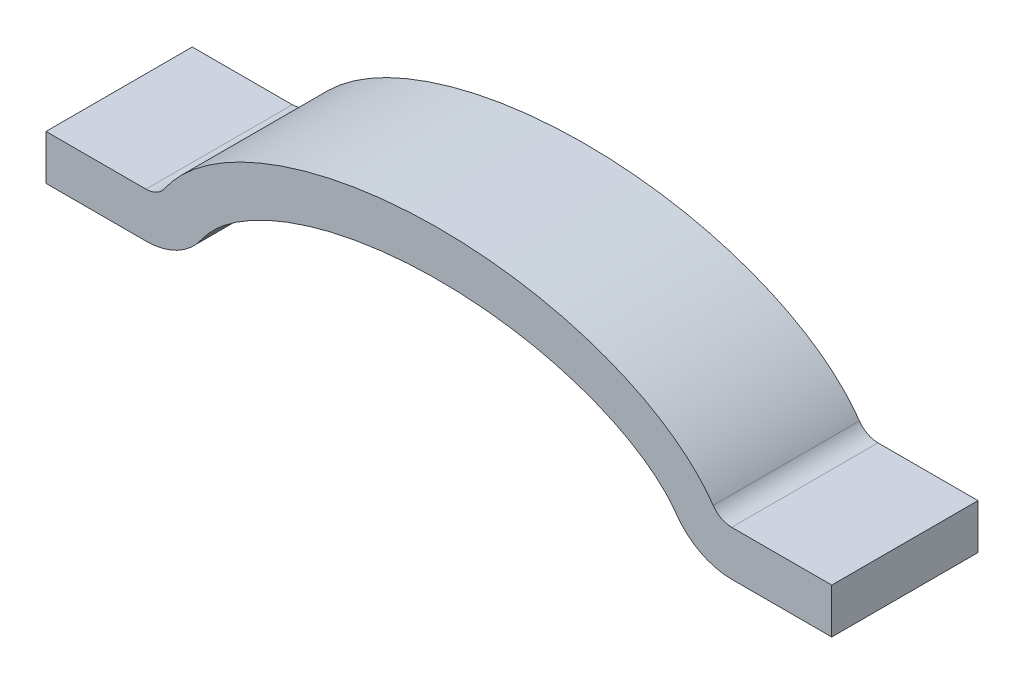
ISO-10303-21;
HEADER;
FILE_DESCRIPTION(('STEP AP214'),'2;1');
FILE_NAME('part.step','',(''),(''),'','','');
FILE_SCHEMA(('AUTOMOTIVE_DESIGN { 1 0 10303 214 1 1 1 1 }'));
ENDSEC;
DATA;
#1=APPLICATION_CONTEXT('core data for automotive mechanical design processes');
#2=APPLICATION_PROTOCOL_DEFINITION('international standard','automotive_design',2000,#1);
#3=PRODUCT_CONTEXT('',#1,'mechanical');
#4=PRODUCT('Part','Part','',(#3));
#5=PRODUCT_RELATED_PRODUCT_CATEGORY('part','',(#4));
#6=PRODUCT_DEFINITION_FORMATION('','',#4);
#7=PRODUCT_DEFINITION_CONTEXT('part definition',#1,'design');
#8=PRODUCT_DEFINITION('design','',#6,#7);
#9=PRODUCT_DEFINITION_SHAPE('','',#8);
#10=(LENGTH_UNIT() NAMED_UNIT(*) SI_UNIT(.MILLI.,.METRE.));
#11=(NAMED_UNIT(*) PLANE_ANGLE_UNIT() SI_UNIT($,.RADIAN.));
#12=(NAMED_UNIT(*) SI_UNIT($,.STERADIAN.) SOLID_ANGLE_UNIT());
#13=UNCERTAINTY_MEASURE_WITH_UNIT(LENGTH_MEASURE(1.E-05),#10,'distance_accuracy_value','');
#14=(GEOMETRIC_REPRESENTATION_CONTEXT(3) GLOBAL_UNCERTAINTY_ASSIGNED_CONTEXT((#13)) GLOBAL_UNIT_ASSIGNED_CONTEXT((#10,
#11,#12)) REPRESENTATION_CONTEXT('',''));
#15=CARTESIAN_POINT('',(0.,0.,0.));
#16=DIRECTION('',(0.,0.,1.));
#17=DIRECTION('',(1.,0.,0.));
#18=AXIS2_PLACEMENT_3D('',#15,#16,#17);
#19=CARTESIAN_POINT('',(34.9161860349977,0.,13.));
#20=DIRECTION('',(1.,0.,0.));
#21=DIRECTION('',(0.,0.,-1.));
#22=AXIS2_PLACEMENT_3D('',#19,#20,#21);
#23=PLANE('',#22);
#24=DIRECTION('',(0.,-1.,0.));
#25=VECTOR('',#24,1.);
#26=CARTESIAN_POINT('',(34.9161860349977,0.,0.));
#27=LINE('',#26,#25);
#28=CARTESIAN_POINT('',(34.9161860349977,4.,0.));
#29=VERTEX_POINT('',#28);
#30=CARTESIAN_POINT('',(34.9161860349977,0.,0.));
#31=VERTEX_POINT('',#30);
#32=EDGE_CURVE('E11',#29,#31,#27,.T.);
#33=ORIENTED_EDGE('',*,*,#32,.F.);
#34=DIRECTION('',(0.,0.,1.));
#35=VECTOR('',#34,1.);
#36=CARTESIAN_POINT('',(34.9161860349977,4.,13.));
#37=LINE('',#36,#35);
#38=CARTESIAN_POINT('',(34.9161860349977,4.,13.));
#39=VERTEX_POINT('',#38);
#40=EDGE_CURVE('E107',#39,#29,#37,.F.);
#41=ORIENTED_EDGE('',*,*,#40,.F.);
#42=DIRECTION('',(0.,-1.,0.));
#43=VECTOR('',#42,1.);
#44=CARTESIAN_POINT('',(34.9161860349977,0.,13.));
#45=LINE('',#44,#43);
#46=CARTESIAN_POINT('',(34.9161860349977,0.,13.));
#47=VERTEX_POINT('',#46);
#48=EDGE_CURVE('E45',#39,#47,#45,.T.);
#49=ORIENTED_EDGE('',*,*,#48,.T.);
#50=DIRECTION('',(0.,0.,-1.));
#51=VECTOR('',#50,1.);
#52=CARTESIAN_POINT('',(34.9161860349977,0.,13.));
#53=LINE('',#52,#51);
#54=EDGE_CURVE('E139',#47,#31,#53,.T.);
#55=ORIENTED_EDGE('',*,*,#54,.T.);
#56=EDGE_LOOP('',(#33,#41,#49,#55));
#57=FACE_BOUND('',#56,.T.);
#58=ADVANCED_FACE('F36',(#57),#23,.T.);
#59=CARTESIAN_POINT('',(-22.,0.,13.));
#60=DIRECTION('',(0.,0.,1.));
#61=DIRECTION('',(1.,0.,0.));
#62=AXIS2_PLACEMENT_3D('',#59,#60,#61);
#63=PLANE('',#62);
#64=DIRECTION('',(1.,0.,0.));
#65=VECTOR('',#64,1.);
#66=CARTESIAN_POINT('',(-22.,0.,13.));
#67=LINE('',#66,#65);
#68=CARTESIAN_POINT('',(-34.9161860349977,0.,13.));
#69=VERTEX_POINT('',#68);
#70=CARTESIAN_POINT('',(-26.0263948261629,0.,13.));
#71=VERTEX_POINT('',#70);
#72=EDGE_CURVE('E162',#69,#71,#67,.T.);
#73=ORIENTED_EDGE('',*,*,#72,.T.);
#74=CARTESIAN_POINT('',(-26.0263948261629,5.99999999999997,13.));
#75=DIRECTION('',(0.,0.,-1.));
#76=DIRECTION('',(-1.,0.,0.));
#77=AXIS2_PLACEMENT_3D('',#74,#75,#76);
#78=CIRCLE('',#77,6.);
#79=CARTESIAN_POINT('',(-21.083393892477,2.59900870780584,13.));
#80=VERTEX_POINT('',#79);
#81=EDGE_CURVE('E53',#71,#80,#78,.F.);
#82=ORIENTED_EDGE('',*,*,#81,.T.);
#83=CARTESIAN_POINT('',(-22.,0.,13.));
#84=CARTESIAN_POINT('',(-22.,0.432036641839711,13.));
#85=CARTESIAN_POINT('',(-21.8548863619666,1.29610992551914,13.));
#86=CARTESIAN_POINT('',(-20.9973878430744,2.88664464705841,13.));
#87=CARTESIAN_POINT('',(-19.2580049467167,4.66938679657808,13.));
#88=CARTESIAN_POINT('',(-15.7412521676776,6.99878575691308,13.));
#89=CARTESIAN_POINT('',(-9.3643610379705,9.3281522587363,13.));
#90=CARTESIAN_POINT('',(0.,10.3359238706319,13.));
#91=CARTESIAN_POINT('',(9.36436103797051,9.3281522587363,13.));
#92=CARTESIAN_POINT('',(15.7412521676776,6.99878575691308,13.));
#93=CARTESIAN_POINT('',(19.2580049467167,4.66938679657808,13.));
#94=CARTESIAN_POINT('',(20.9973878430744,2.8866446470584,13.));
#95=CARTESIAN_POINT('',(21.8548863619666,1.29610992551914,13.));
#96=CARTESIAN_POINT('',(22.,0.432036641839715,13.));
#97=CARTESIAN_POINT('',(22.,0.,13.));
#98=B_SPLINE_CURVE_WITH_KNOTS('',3,(#83,#84,#85,#86,#87,#88,#89,#90,#91,#92,#93,#94,#95,#96,
#97),.UNSPECIFIED.,.F.,.F.,(4,1,1,1,1,1,1,1,1,1,1,1,4),(3.14159265358979,3.33794219443916,
3.53429173528852,3.73064127613788,3.92699081698724,4.31968989868597,4.71238898038469,
5.10508806208341,5.49778714378214,5.6941366846315,5.89048622548086,6.08683576633022,
6.28318530717959),.UNSPECIFIED.);
#99=CARTESIAN_POINT('',(21.083393892477,2.59900870780584,13.));
#100=VERTEX_POINT('',#99);
#101=EDGE_CURVE('E163',#80,#100,#98,.T.);
#102=ORIENTED_EDGE('',*,*,#101,.T.);
#103=CARTESIAN_POINT('',(26.0263948261629,5.99999999999997,13.));
#104=DIRECTION('',(0.,0.,-1.));
#105=DIRECTION('',(-1.,0.,0.));
#106=AXIS2_PLACEMENT_3D('',#103,#104,#105);
#107=CIRCLE('',#106,6.);
#108=CARTESIAN_POINT('',(26.0263948261629,0.,13.));
#109=VERTEX_POINT('',#108);
#110=EDGE_CURVE('E160',#100,#109,#107,.F.);
#111=ORIENTED_EDGE('',*,*,#110,.T.);
#112=DIRECTION('',(1.,0.,0.));
#113=VECTOR('',#112,1.);
#114=CARTESIAN_POINT('',(22.,0.,13.));
#115=LINE('',#114,#113);
#116=EDGE_CURVE('E151',#109,#47,#115,.T.);
#117=ORIENTED_EDGE('',*,*,#116,.T.);
#118=ORIENTED_EDGE('',*,*,#48,.F.);
#119=DIRECTION('',(-1.,0.,0.));
#120=VECTOR('',#119,1.);
#121=CARTESIAN_POINT('',(22.,4.,13.));
#122=LINE('',#121,#120);
#123=CARTESIAN_POINT('',(26.0263948261629,4.,13.));
#124=VERTEX_POINT('',#123);
#125=EDGE_CURVE('E231',#124,#39,#122,.F.);
#126=ORIENTED_EDGE('',*,*,#125,.F.);
#127=CARTESIAN_POINT('',(26.0263948261629,5.99999999999997,13.));
#128=DIRECTION('',(0.,0.,-1.));
#129=DIRECTION('',(-1.,0.,0.));
#130=AXIS2_PLACEMENT_3D('',#127,#128,#129);
#131=CIRCLE('',#130,2.);
#132=CARTESIAN_POINT('',(24.3787278482676,4.86633623593526,13.));
#133=VERTEX_POINT('',#132);
#134=EDGE_CURVE('E102',#133,#124,#131,.F.);
#135=ORIENTED_EDGE('',*,*,#134,.F.);
#136=CARTESIAN_POINT('',(-26.,-5.25591541948676E-09,13.));
#137=CARTESIAN_POINT('',(-26.0000116676451,0.111537247286349,13.));
#138=CARTESIAN_POINT('',(-25.9976258289216,0.223078285323674,13.));
#139=CARTESIAN_POINT('',(-25.9878872850968,0.448666430823199,13.));
#140=CARTESIAN_POINT('',(-25.9804149655458,0.56270837405115,13.));
#141=CARTESIAN_POINT('',(-25.9601396738284,0.792413314224165,13.));
#142=CARTESIAN_POINT('',(-25.9472420470309,0.908067983077297,13.));
#143=CARTESIAN_POINT('',(-25.915945897434,1.14006903279323,13.));
#144=CARTESIAN_POINT('',(-25.8974821013963,1.25640660479358,13.));
#145=CARTESIAN_POINT('',(-25.8550595671101,1.48888395466193,13.));
#146=CARTESIAN_POINT('',(-25.8310646704827,1.6050171275041,13.));
#147=CARTESIAN_POINT('',(-25.7777484707093,1.83630999130887,13.));
#148=CARTESIAN_POINT('',(-25.7484160494636,1.95146711504999,13.));
#149=CARTESIAN_POINT('',(-25.6847150602839,2.18020284317876,13.));
#150=CARTESIAN_POINT('',(-25.6503536260085,2.29378343805561,13.));
#151=CARTESIAN_POINT('',(-25.576956710448,2.51896209143195,13.));
#152=CARTESIAN_POINT('',(-25.5379387429657,2.63056587201652,13.));
#153=CARTESIAN_POINT('',(-25.4552024021435,2.85270133325781,13.));
#154=CARTESIAN_POINT('',(-25.4114597755304,2.96322396550021,13.));
#155=CARTESIAN_POINT('',(-25.3189473938992,3.18415346660159,13.));
#156=CARTESIAN_POINT('',(-25.2701104006534,3.2945321547338,13.));
#157=CARTESIAN_POINT('',(-25.1674048004263,3.5150226557403,13.));
#158=CARTESIAN_POINT('',(-25.1134695287242,3.62510338377648,13.));
#159=CARTESIAN_POINT('',(-25.0005687603073,3.84486090717794,13.));
#160=CARTESIAN_POINT('',(-24.9415371214083,3.9545036889688,13.));
#161=CARTESIAN_POINT('',(-24.8184478876507,4.17326325245095,13.));
#162=CARTESIAN_POINT('',(-24.7543245859132,4.28234302730507,13.));
#163=CARTESIAN_POINT('',(-24.6210568142596,4.49987062809492,13.));
#164=CARTESIAN_POINT('',(-24.551846981188,4.60827837147226,13.));
#165=CARTESIAN_POINT('',(-24.4084091092638,4.82437233822117,13.));
#166=CARTESIAN_POINT('',(-24.3341159707699,4.93201530889777,13.));
#167=CARTESIAN_POINT('',(-24.1805098064464,5.1465060090048,13.));
#168=CARTESIAN_POINT('',(-24.1011318763264,5.25330721555847,13.));
#169=CARTESIAN_POINT('',(-23.9376358793378,5.465685050551,13.));
#170=CARTESIAN_POINT('',(-23.8534658733088,5.57122165086724,13.));
#171=CARTESIAN_POINT('',(-23.6806810325843,5.78080997511271,13.));
#172=CARTESIAN_POINT('',(-23.5920238340478,5.88482672709309,13.));
#173=CARTESIAN_POINT('',(-23.4102450544272,6.09150776484632,13.));
#174=CARTESIAN_POINT('',(-23.3170780484472,6.19413207563363,13.));
#175=CARTESIAN_POINT('',(-23.1262558984359,6.39810968013806,13.));
#176=CARTESIAN_POINT('',(-23.0285536250027,6.49941876570225,13.));
#177=CARTESIAN_POINT('',(-22.7261165515322,6.80408823826286,13.));
#178=CARTESIAN_POINT('',(-22.5167459416307,7.00287359830188,13.));
#179=CARTESIAN_POINT('',(-22.0798868853556,7.39575577415625,13.));
#180=CARTESIAN_POINT('',(-21.8520176546229,7.58942688279915,13.));
#181=CARTESIAN_POINT('',(-21.3789946630926,7.97090126508661,13.));
#182=CARTESIAN_POINT('',(-21.13351925821,8.15830480213568,13.));
#183=CARTESIAN_POINT('',(-20.6264401691121,8.52651690174705,13.));
#184=CARTESIAN_POINT('',(-20.3645738543199,8.7069625142317,13.));
#185=CARTESIAN_POINT('',(-19.8247588027536,9.06125072564397,13.));
#186=CARTESIAN_POINT('',(-19.546563156856,9.2347161911291,13.));
#187=CARTESIAN_POINT('',(-18.9741946965365,9.57474769189839,13.));
#188=CARTESIAN_POINT('',(-18.6797941952976,9.74092968282077,13.));
#189=CARTESIAN_POINT('',(-18.0763789806,10.0652540159631,13.));
#190=CARTESIAN_POINT('',(-17.7671841379604,10.2230603717114,13.));
#191=CARTESIAN_POINT('',(-17.1358146082921,10.5301159281395,13.));
#192=CARTESIAN_POINT('',(-16.8135048236157,10.6790864692833,13.));
#193=CARTESIAN_POINT('',(-16.1563567979412,10.9685343106685,13.));
#194=CARTESIAN_POINT('',(-15.8214002132375,11.1087422747537,13.));
#195=CARTESIAN_POINT('',(-15.1394655070584,11.380573016466,13.));
#196=CARTESIAN_POINT('',(-14.7923851076409,11.5119386431155,13.));
#197=CARTESIAN_POINT('',(-14.086757023152,11.7658746909795,13.));
#198=CARTESIAN_POINT('',(-13.7281218143803,11.88820144439,13.));
#199=CARTESIAN_POINT('',(-12.9999804917653,12.1237597026379,13.));
#200=CARTESIAN_POINT('',(-12.6304001582384,12.2367614083769,13.));
#201=CARTESIAN_POINT('',(-11.8810004293432,12.4532996975759,13.));
#202=CARTESIAN_POINT('',(-11.501118686008,12.5566202125045,13.));
#203=CARTESIAN_POINT('',(-10.7317776314485,12.7533690968808,13.));
#204=CARTESIAN_POINT('',(-10.3422665196632,12.846594671185,13.));
#205=CARTESIAN_POINT('',(-9.55512700269836,13.0225123751248,13.));
#206=CARTESIAN_POINT('',(-9.15746143610106,13.1050381251034,13.));
#207=CARTESIAN_POINT('',(-8.35560256669944,13.2593762182577,13.));
#208=CARTESIAN_POINT('',(-7.95138522936855,13.331062741599,13.));
#209=CARTESIAN_POINT('',(-6.72488526673784,13.5309431058362,13.));
#210=CARTESIAN_POINT('',(-5.89967836668501,13.6415405098872,13.));
#211=CARTESIAN_POINT('',(-4.23333341247432,13.8198639361473,13.));
#212=CARTESIAN_POINT('',(-3.39213171827096,13.8869837014631,13.));
#213=CARTESIAN_POINT('',(-1.70063272261015,13.9772291723469,13.));
#214=CARTESIAN_POINT('',(-0.850316361305075,14.,13.));
#215=CARTESIAN_POINT('',(0.850316361304433,14.,13.));
#216=CARTESIAN_POINT('',(1.70063272260886,13.977229172347,13.));
#217=CARTESIAN_POINT('',(3.39213171826967,13.8869837014632,13.));
#218=CARTESIAN_POINT('',(4.23333341247369,13.8198639361473,13.));
#219=CARTESIAN_POINT('',(5.89967836667695,13.6415405098881,13.));
#220=CARTESIAN_POINT('',(6.72488526672175,13.5309431058383,13.));
#221=CARTESIAN_POINT('',(7.95138522934303,13.3310627416034,13.));
#222=CARTESIAN_POINT('',(8.35560256667242,13.2593762182626,13.));
#223=CARTESIAN_POINT('',(9.15746143609327,13.1050381251052,13.));
#224=CARTESIAN_POINT('',(9.55512700271117,13.0225123751223,13.));
#225=CARTESIAN_POINT('',(10.342266519711,12.846594671174,13.));
#226=CARTESIAN_POINT('',(10.7317776315108,12.7533690968658,13.));
#227=CARTESIAN_POINT('',(11.5011186860734,12.556620212487,13.));
#228=CARTESIAN_POINT('',(11.8810004293976,12.4532996975607,13.));
#229=CARTESIAN_POINT('',(12.6304001582672,12.2367614083681,13.));
#230=CARTESIAN_POINT('',(12.9999804917797,12.1237597026333,13.));
#231=CARTESIAN_POINT('',(13.7281218143619,11.888201444396,13.));
#232=CARTESIAN_POINT('',(14.0867570231153,11.7658746909921,13.));
#233=CARTESIAN_POINT('',(14.7923851076046,11.5119386431292,13.));
#234=CARTESIAN_POINT('',(15.1394655070404,11.3805730164732,13.));
#235=CARTESIAN_POINT('',(15.8214002133122,11.1087422747239,13.));
#236=CARTESIAN_POINT('',(16.1563567980896,10.9685343106064,13.));
#237=CARTESIAN_POINT('',(16.8135048237357,10.6790864692273,13.));
#238=CARTESIAN_POINT('',(17.1358146083127,10.5301159281282,13.));
#239=CARTESIAN_POINT('',(17.7671841378536,10.2230603717646,13.));
#240=CARTESIAN_POINT('',(18.0763789804637,10.0652540160334,13.));
#241=CARTESIAN_POINT('',(18.6797941951791,9.74092968288742,13.));
#242=CARTESIAN_POINT('',(18.9741946964635,9.57474769194123,13.));
#243=CARTESIAN_POINT('',(19.5465631567266,9.23471619120654,13.));
#244=CARTESIAN_POINT('',(19.8247588025261,9.06125072578613,13.));
#245=CARTESIAN_POINT('',(20.3645738540333,8.70696251442677,13.));
#246=CARTESIAN_POINT('',(20.6264401688605,8.52651690192429,13.));
#247=CARTESIAN_POINT('',(21.1335192580166,8.1583048022814,13.));
#248=CARTESIAN_POINT('',(21.3789946629229,7.97090126521917,13.));
#249=CARTESIAN_POINT('',(21.8520176544375,7.58942688295277,13.));
#250=CARTESIAN_POINT('',(22.0798868851335,7.3957557743473,13.));
#251=CARTESIAN_POINT('',(22.5167459416699,7.00287359827503,13.));
#252=CARTESIAN_POINT('',(22.7261165518533,6.80408823796273,13.));
#253=CARTESIAN_POINT('',(23.0285536251686,6.49941876552382,13.));
#254=CARTESIAN_POINT('',(23.126255898194,6.3981096803828,13.));
#255=CARTESIAN_POINT('',(23.3170780480187,6.19413207610534,13.));
#256=CARTESIAN_POINT('',(23.4102450542003,6.09150776510358,13.));
#257=CARTESIAN_POINT('',(23.5920238341204,5.88482672701131,13.));
#258=CARTESIAN_POINT('',(23.6806810327581,5.78080997490921,13.));
#259=CARTESIAN_POINT('',(23.8534658733679,5.5712216507883,13.));
#260=CARTESIAN_POINT('',(23.9376358791933,5.4656850507284,13.));
#261=CARTESIAN_POINT('',(24.1011318761151,5.25330721584322,13.));
#262=CARTESIAN_POINT('',(24.1805098063578,5.14650600912951,13.));
#263=CARTESIAN_POINT('',(24.3341159706946,4.93201530900185,13.));
#264=CARTESIAN_POINT('',(24.40840910909,4.82437233847237,13.));
#265=CARTESIAN_POINT('',(24.5518469807964,4.60827837207256,13.));
#266=CARTESIAN_POINT('',(24.6210568137503,4.49987062889827,13.));
#267=CARTESIAN_POINT('',(24.7543245855127,4.28234302798651,13.));
#268=CARTESIAN_POINT('',(24.8184478874569,4.17326325279536,13.));
#269=CARTESIAN_POINT('',(24.9415371216399,3.95450368855732,13.));
#270=CARTESIAN_POINT('',(25.000568760755,3.84486090634631,13.));
#271=CARTESIAN_POINT('',(25.1134695291365,3.62510338293474,13.));
#272=CARTESIAN_POINT('',(25.1674048006193,3.51502265532528,13.));
#273=CARTESIAN_POINT('',(25.2701104007492,3.29453215452878,13.));
#274=CARTESIAN_POINT('',(25.3189473940913,3.18415346616786,13.));
#275=CARTESIAN_POINT('',(25.4114597756033,2.96322396530142,13.));
#276=CARTESIAN_POINT('',(25.4552024020288,2.85270133353429,13.));
#277=CARTESIAN_POINT('',(25.5379387427875,2.63056587252623,13.));
#278=CARTESIAN_POINT('',(25.5769567103644,2.51896209168857,13.));
#279=CARTESIAN_POINT('',(25.6503536260101,2.29378343805051,13.));
#280=CARTESIAN_POINT('',(25.684715060287,2.18020284316853,13.));
#281=CARTESIAN_POINT('',(25.7484160493808,1.95146711534656,13.));
#282=CARTESIAN_POINT('',(25.7777484705532,1.83630999192129,13.));
#283=CARTESIAN_POINT('',(25.83106467028,1.60501712844776,13.));
#284=CARTESIAN_POINT('',(25.8550595669203,1.48888395561773,13.));
#285=CARTESIAN_POINT('',(25.8974821012935,1.25640660544136,13.));
#286=CARTESIAN_POINT('',(25.9159458973902,1.14006903311805,13.));
#287=CARTESIAN_POINT('',(25.9472420469846,0.908067983421301,13.));
#288=CARTESIAN_POINT('',(25.9601396737515,0.792413314914489,13.));
#289=CARTESIAN_POINT('',(25.9804149655618,0.562708374048563,13.));
#290=CARTESIAN_POINT('',(25.9878872851732,0.448666429775861,13.));
#291=CARTESIAN_POINT('',(25.9976258289061,0.223078284976777,13.));
#292=CARTESIAN_POINT('',(26.0000116675999,0.111537248689892,13.));
#293=CARTESIAN_POINT('',(26.,-2.10236242051774E-09,13.));
#294=B_SPLINE_CURVE_WITH_KNOTS('',3,(#136,#137,#138,#139,#140,#141,#142,#143,#144,#145,#146,
#147,#148,#149,#150,#151,#152,#153,#154,#155,#156,#157,#158,#159,#160,#161,#162,#163,#164,#165,
#166,#167,#168,#169,#170,#171,#172,#173,#174,#175,#176,#177,#178,#179,#180,#181,#182,#183,#184,
#185,#186,#187,#188,#189,#190,#191,#192,#193,#194,#195,#196,#197,#198,#199,#200,#201,#202,#203,
#204,#205,#206,#207,#208,#209,#210,#211,#212,#213,#214,#215,#216,#217,#218,#219,#220,#221,#222,
#223,#224,#225,#226,#227,#228,#229,#230,#231,#232,#233,#234,#235,#236,#237,#238,#239,#240,#241,
#242,#243,#244,#245,#246,#247,#248,#249,#250,#251,#252,#253,#254,#255,#256,#257,#258,#259,#260,
#261,#262,#263,#264,#265,#266,#267,#268,#269,#270,#271,#272,#273,#274,#275,#276,#277,#278,#279,
#280,#281,#282,#283,#284,#285,#286,#287,#288,#289,#290,#291,#292,#293),.UNSPECIFIED.,.F.,.F.,(4,
2,2,2,2,2,2,2,2,2,2,2,2,2,2,2,2,2,2,2,2,2,2,2,2,2,2,2,2,2,2,2,2,2,2,2,2,2,2,2,2,2,2,2,2,2,2,2,2,
2,2,2,2,2,2,2,2,2,2,2,2,2,2,2,2,2,2,2,2,2,2,2,2,2,2,2,2,2,4),(0.,0.334591789746542,
0.677336812858055,1.02632737627372,1.37958114205443,1.73521322792134,2.09159475891316,
2.44747557596909,2.80205773509361,3.1585553708871,3.52056192024408,3.88822160551874,
4.26170458649938,4.64121147442852,5.02697649710909,5.41926944722264,5.8183965570049,
6.22329407200158,6.63324503470354,7.04899786213921,7.47118101830255,8.33679232254686,
9.2335334475586,10.1596351408929,11.1133345604709,12.0965467306585,13.1104308997004,
14.1515568356346,15.2165209576283,16.3056441657962,17.4187588005548,18.5553293801477,
19.7145470935532,20.8954045060722,22.0967554563243,23.3149837249181,24.5464165421089,
27.0427967760967,29.5732773915513,32.1239249127651,34.6745724339769,37.2050530494334,
39.7014332833969,40.932866100583,42.15109436924,43.352445319537,44.5333027320222,
45.6925204453825,46.8290910249172,47.9422056597339,49.031328868143,50.0962929898102,
51.1374189256425,52.1513030948383,53.1345152646738,54.0882146843685,55.014316377783,
55.9110575026386,56.7766688080581,57.1988519624594,57.6146047907775,58.024555753954,
58.4294532679691,58.8285803783557,59.2208733279385,59.6066383499161,59.9861452390305,
60.3596282214272,60.7272879052643,61.0892944553647,61.4457920896268,61.8003742495608,
62.1562550666327,62.512636596653,62.8682686824921,63.2215224492561,63.5705130116307,
63.9132580378779,64.247849822377),.UNSPECIFIED.);
#295=CARTESIAN_POINT('',(-24.3787278482676,4.86633623593526,13.));
#296=VERTEX_POINT('',#295);
#297=EDGE_CURVE('E226',#296,#133,#294,.T.);
#298=ORIENTED_EDGE('',*,*,#297,.F.);
#299=CARTESIAN_POINT('',(-26.0263948261629,5.99999999999997,13.));
#300=DIRECTION('',(0.,0.,-1.));
#301=DIRECTION('',(-1.,0.,0.));
#302=AXIS2_PLACEMENT_3D('',#299,#300,#301);
#303=CIRCLE('',#302,2.);
#304=CARTESIAN_POINT('',(-26.0263948261629,3.99999999999997,13.));
#305=VERTEX_POINT('',#304);
#306=EDGE_CURVE('E232',#305,#296,#303,.F.);
#307=ORIENTED_EDGE('',*,*,#306,.F.);
#308=DIRECTION('',(-1.,0.,0.));
#309=VECTOR('',#308,1.);
#310=CARTESIAN_POINT('',(-22.,4.,13.));
#311=LINE('',#310,#309);
#312=CARTESIAN_POINT('',(-34.9161860349977,4.,13.));
#313=VERTEX_POINT('',#312);
#314=EDGE_CURVE('E240',#313,#305,#311,.F.);
#315=ORIENTED_EDGE('',*,*,#314,.F.);
#316=DIRECTION('',(0.,-1.,0.));
#317=VECTOR('',#316,1.);
#318=CARTESIAN_POINT('',(-34.9161860349977,0.,13.));
#319=LINE('',#318,#317);
#320=EDGE_CURVE('E131',#313,#69,#319,.T.);
#321=ORIENTED_EDGE('',*,*,#320,.T.);
#322=EDGE_LOOP('',(#73,#82,#102,#111,#117,#118,#126,#135,#298,#307,#315,#321));
#323=FACE_BOUND('',#322,.T.);
#324=ADVANCED_FACE('F158',(#323),#63,.T.);
#325=CARTESIAN_POINT('',(-34.9161860349977,0.,13.));
#326=DIRECTION('',(1.,0.,0.));
#327=DIRECTION('',(0.,0.,-1.));
#328=AXIS2_PLACEMENT_3D('',#325,#326,#327);
#329=PLANE('',#328);
#330=ORIENTED_EDGE('',*,*,#320,.F.);
#331=DIRECTION('',(0.,0.,1.));
#332=VECTOR('',#331,1.);
#333=CARTESIAN_POINT('',(-34.9161860349977,4.,13.));
#334=LINE('',#333,#332);
#335=CARTESIAN_POINT('',(-34.9161860349977,4.,0.));
#336=VERTEX_POINT('',#335);
#337=EDGE_CURVE('E241',#313,#336,#334,.F.);
#338=ORIENTED_EDGE('',*,*,#337,.T.);
#339=DIRECTION('',(0.,-1.,0.));
#340=VECTOR('',#339,1.);
#341=CARTESIAN_POINT('',(-34.9161860349977,0.,0.));
#342=LINE('',#341,#340);
#343=CARTESIAN_POINT('',(-34.9161860349977,0.,0.));
#344=VERTEX_POINT('',#343);
#345=EDGE_CURVE('E128',#336,#344,#342,.T.);
#346=ORIENTED_EDGE('',*,*,#345,.T.);
#347=DIRECTION('',(0.,0.,-1.));
#348=VECTOR('',#347,1.);
#349=CARTESIAN_POINT('',(-34.9161860349977,0.,13.));
#350=LINE('',#349,#348);
#351=EDGE_CURVE('E156',#69,#344,#350,.T.);
#352=ORIENTED_EDGE('',*,*,#351,.F.);
#353=EDGE_LOOP('',(#330,#338,#346,#352));
#354=FACE_BOUND('',#353,.T.);
#355=ADVANCED_FACE('F266',(#354),#329,.F.);
#356=CARTESIAN_POINT('',(26.0263948261629,5.99999999999997,0.));
#357=DIRECTION('',(0.,0.,1.));
#358=DIRECTION('',(1.,0.,0.));
#359=AXIS2_PLACEMENT_3D('',#356,#357,#358);
#360=PLANE('',#359);
#361=CARTESIAN_POINT('',(26.0263948261629,5.99999999999997,0.));
#362=DIRECTION('',(0.,0.,-1.));
#363=DIRECTION('',(-1.,0.,0.));
#364=AXIS2_PLACEMENT_3D('',#361,#362,#363);
#365=CIRCLE('',#364,2.);
#366=CARTESIAN_POINT('',(26.0263948261629,3.99999999999997,0.));
#367=VERTEX_POINT('',#366);
#368=CARTESIAN_POINT('',(24.3787278482676,4.86633623593526,0.));
#369=VERTEX_POINT('',#368);
#370=EDGE_CURVE('E99',#367,#369,#365,.T.);
#371=ORIENTED_EDGE('',*,*,#370,.F.);
#372=DIRECTION('',(-1.,0.,0.));
#373=VECTOR('',#372,1.);
#374=CARTESIAN_POINT('',(22.,4.,0.));
#375=LINE('',#374,#373);
#376=EDGE_CURVE('E111',#367,#29,#375,.F.);
#377=ORIENTED_EDGE('',*,*,#376,.T.);
#378=ORIENTED_EDGE('',*,*,#32,.T.);
#379=DIRECTION('',(1.,0.,0.));
#380=VECTOR('',#379,1.);
#381=CARTESIAN_POINT('',(22.,0.,0.));
#382=LINE('',#381,#380);
#383=CARTESIAN_POINT('',(26.0263948261629,0.,0.));
#384=VERTEX_POINT('',#383);
#385=EDGE_CURVE('E154',#384,#31,#382,.T.);
#386=ORIENTED_EDGE('',*,*,#385,.F.);
#387=CARTESIAN_POINT('',(26.0263948261629,5.99999999999997,0.));
#388=DIRECTION('',(0.,0.,-1.));
#389=DIRECTION('',(-1.,0.,0.));
#390=AXIS2_PLACEMENT_3D('',#387,#388,#389);
#391=CIRCLE('',#390,6.);
#392=CARTESIAN_POINT('',(21.083393892477,2.59900870780584,0.));
#393=VERTEX_POINT('',#392);
#394=EDGE_CURVE('E187',#384,#393,#391,.T.);
#395=ORIENTED_EDGE('',*,*,#394,.T.);
#396=CARTESIAN_POINT('',(-22.,0.,0.));
#397=CARTESIAN_POINT('',(-22.,0.432036641839711,0.));
#398=CARTESIAN_POINT('',(-21.8548863619666,1.29610992551914,0.));
#399=CARTESIAN_POINT('',(-20.9973878430744,2.88664464705841,0.));
#400=CARTESIAN_POINT('',(-19.2580049467167,4.66938679657808,0.));
#401=CARTESIAN_POINT('',(-15.7412521676776,6.99878575691308,0.));
#402=CARTESIAN_POINT('',(-9.3643610379705,9.3281522587363,0.));
#403=CARTESIAN_POINT('',(0.,10.3359238706319,0.));
#404=CARTESIAN_POINT('',(9.36436103797051,9.3281522587363,0.));
#405=CARTESIAN_POINT('',(15.7412521676776,6.99878575691308,0.));
#406=CARTESIAN_POINT('',(19.2580049467167,4.66938679657808,0.));
#407=CARTESIAN_POINT('',(20.9973878430744,2.8866446470584,0.));
#408=CARTESIAN_POINT('',(21.8548863619666,1.29610992551914,0.));
#409=CARTESIAN_POINT('',(22.,0.432036641839715,0.));
#410=CARTESIAN_POINT('',(22.,0.,0.));
#411=B_SPLINE_CURVE_WITH_KNOTS('',3,(#396,#397,#398,#399,#400,#401,#402,#403,#404,#405,#406,
#407,#408,#409,#410),.UNSPECIFIED.,.F.,.F.,(4,1,1,1,1,1,1,1,1,1,1,1,4),(3.14159265358979,
3.33794219443916,3.53429173528852,3.73064127613788,3.92699081698724,4.31968989868597,
4.71238898038469,5.10508806208341,5.49778714378214,5.6941366846315,5.89048622548086,
6.08683576633022,6.28318530717959),.UNSPECIFIED.);
#412=CARTESIAN_POINT('',(-21.083393892477,2.59900870780584,0.));
#413=VERTEX_POINT('',#412);
#414=EDGE_CURVE('E169',#413,#393,#411,.T.);
#415=ORIENTED_EDGE('',*,*,#414,.F.);
#416=CARTESIAN_POINT('',(-26.0263948261629,5.99999999999997,0.));
#417=DIRECTION('',(0.,0.,-1.));
#418=DIRECTION('',(-1.,0.,0.));
#419=AXIS2_PLACEMENT_3D('',#416,#417,#418);
#420=CIRCLE('',#419,6.);
#421=CARTESIAN_POINT('',(-26.0263948261629,0.,0.));
#422=VERTEX_POINT('',#421);
#423=EDGE_CURVE('E184',#413,#422,#420,.T.);
#424=ORIENTED_EDGE('',*,*,#423,.T.);
#425=DIRECTION('',(1.,0.,0.));
#426=VECTOR('',#425,1.);
#427=CARTESIAN_POINT('',(-22.,0.,0.));
#428=LINE('',#427,#426);
#429=EDGE_CURVE('E166',#344,#422,#428,.T.);
#430=ORIENTED_EDGE('',*,*,#429,.F.);
#431=ORIENTED_EDGE('',*,*,#345,.F.);
#432=DIRECTION('',(-1.,0.,0.));
#433=VECTOR('',#432,1.);
#434=CARTESIAN_POINT('',(-22.,4.,0.));
#435=LINE('',#434,#433);
#436=CARTESIAN_POINT('',(-26.0263948261629,4.,0.));
#437=VERTEX_POINT('',#436);
#438=EDGE_CURVE('E115',#336,#437,#435,.F.);
#439=ORIENTED_EDGE('',*,*,#438,.T.);
#440=CARTESIAN_POINT('',(-26.0263948261629,5.99999999999997,0.));
#441=DIRECTION('',(0.,0.,-1.));
#442=DIRECTION('',(-1.,0.,0.));
#443=AXIS2_PLACEMENT_3D('',#440,#441,#442);
#444=CIRCLE('',#443,2.);
#445=CARTESIAN_POINT('',(-24.3787278482676,4.86633623593526,0.));
#446=VERTEX_POINT('',#445);
#447=EDGE_CURVE('E106',#446,#437,#444,.T.);
#448=ORIENTED_EDGE('',*,*,#447,.F.);
#449=CARTESIAN_POINT('',(-26.,-5.25591541948676E-09,0.));
#450=CARTESIAN_POINT('',(-26.0000116676451,0.111537247286349,0.));
#451=CARTESIAN_POINT('',(-25.9976258289216,0.223078285323674,0.));
#452=CARTESIAN_POINT('',(-25.9878872850968,0.448666430823199,0.));
#453=CARTESIAN_POINT('',(-25.9804149655458,0.56270837405115,0.));
#454=CARTESIAN_POINT('',(-25.9601396738284,0.792413314224165,0.));
#455=CARTESIAN_POINT('',(-25.9472420470309,0.908067983077297,0.));
#456=CARTESIAN_POINT('',(-25.915945897434,1.14006903279323,0.));
#457=CARTESIAN_POINT('',(-25.8974821013963,1.25640660479358,0.));
#458=CARTESIAN_POINT('',(-25.8550595671101,1.48888395466193,0.));
#459=CARTESIAN_POINT('',(-25.8310646704827,1.6050171275041,0.));
#460=CARTESIAN_POINT('',(-25.7777484707093,1.83630999130887,0.));
#461=CARTESIAN_POINT('',(-25.7484160494636,1.95146711504999,0.));
#462=CARTESIAN_POINT('',(-25.6847150602839,2.18020284317876,0.));
#463=CARTESIAN_POINT('',(-25.6503536260085,2.29378343805561,0.));
#464=CARTESIAN_POINT('',(-25.576956710448,2.51896209143195,0.));
#465=CARTESIAN_POINT('',(-25.5379387429657,2.63056587201652,0.));
#466=CARTESIAN_POINT('',(-25.4552024021435,2.85270133325781,0.));
#467=CARTESIAN_POINT('',(-25.4114597755304,2.96322396550021,0.));
#468=CARTESIAN_POINT('',(-25.3189473938992,3.18415346660159,0.));
#469=CARTESIAN_POINT('',(-25.2701104006534,3.2945321547338,0.));
#470=CARTESIAN_POINT('',(-25.1674048004263,3.5150226557403,0.));
#471=CARTESIAN_POINT('',(-25.1134695287242,3.62510338377648,0.));
#472=CARTESIAN_POINT('',(-25.0005687603073,3.84486090717794,0.));
#473=CARTESIAN_POINT('',(-24.9415371214083,3.9545036889688,0.));
#474=CARTESIAN_POINT('',(-24.8184478876507,4.17326325245095,0.));
#475=CARTESIAN_POINT('',(-24.7543245859132,4.28234302730507,0.));
#476=CARTESIAN_POINT('',(-24.6210568142596,4.49987062809492,0.));
#477=CARTESIAN_POINT('',(-24.551846981188,4.60827837147226,0.));
#478=CARTESIAN_POINT('',(-24.4084091092638,4.82437233822117,0.));
#479=CARTESIAN_POINT('',(-24.3341159707699,4.93201530889777,0.));
#480=CARTESIAN_POINT('',(-24.1805098064464,5.1465060090048,0.));
#481=CARTESIAN_POINT('',(-24.1011318763264,5.25330721555847,0.));
#482=CARTESIAN_POINT('',(-23.9376358793378,5.465685050551,0.));
#483=CARTESIAN_POINT('',(-23.8534658733088,5.57122165086724,0.));
#484=CARTESIAN_POINT('',(-23.6806810325843,5.78080997511271,0.));
#485=CARTESIAN_POINT('',(-23.5920238340478,5.88482672709309,0.));
#486=CARTESIAN_POINT('',(-23.4102450544272,6.09150776484632,0.));
#487=CARTESIAN_POINT('',(-23.3170780484472,6.19413207563363,0.));
#488=CARTESIAN_POINT('',(-23.1262558984359,6.39810968013806,0.));
#489=CARTESIAN_POINT('',(-23.0285536250027,6.49941876570225,0.));
#490=CARTESIAN_POINT('',(-22.7261165515322,6.80408823826286,0.));
#491=CARTESIAN_POINT('',(-22.5167459416307,7.00287359830188,0.));
#492=CARTESIAN_POINT('',(-22.0798868853556,7.39575577415625,0.));
#493=CARTESIAN_POINT('',(-21.8520176546229,7.58942688279915,0.));
#494=CARTESIAN_POINT('',(-21.3789946630926,7.97090126508661,0.));
#495=CARTESIAN_POINT('',(-21.13351925821,8.15830480213568,0.));
#496=CARTESIAN_POINT('',(-20.6264401691121,8.52651690174705,0.));
#497=CARTESIAN_POINT('',(-20.3645738543199,8.7069625142317,0.));
#498=CARTESIAN_POINT('',(-19.8247588027536,9.06125072564397,0.));
#499=CARTESIAN_POINT('',(-19.546563156856,9.2347161911291,0.));
#500=CARTESIAN_POINT('',(-18.9741946965365,9.57474769189839,0.));
#501=CARTESIAN_POINT('',(-18.6797941952976,9.74092968282077,0.));
#502=CARTESIAN_POINT('',(-18.0763789806,10.0652540159631,0.));
#503=CARTESIAN_POINT('',(-17.7671841379604,10.2230603717114,0.));
#504=CARTESIAN_POINT('',(-17.1358146082921,10.5301159281395,0.));
#505=CARTESIAN_POINT('',(-16.8135048236157,10.6790864692833,0.));
#506=CARTESIAN_POINT('',(-16.1563567979412,10.9685343106685,0.));
#507=CARTESIAN_POINT('',(-15.8214002132375,11.1087422747537,0.));
#508=CARTESIAN_POINT('',(-15.1394655070584,11.380573016466,0.));
#509=CARTESIAN_POINT('',(-14.7923851076409,11.5119386431155,0.));
#510=CARTESIAN_POINT('',(-14.086757023152,11.7658746909795,0.));
#511=CARTESIAN_POINT('',(-13.7281218143803,11.88820144439,0.));
#512=CARTESIAN_POINT('',(-12.9999804917653,12.1237597026379,0.));
#513=CARTESIAN_POINT('',(-12.6304001582384,12.2367614083769,0.));
#514=CARTESIAN_POINT('',(-11.8810004293432,12.4532996975759,0.));
#515=CARTESIAN_POINT('',(-11.501118686008,12.5566202125045,0.));
#516=CARTESIAN_POINT('',(-10.7317776314485,12.7533690968808,0.));
#517=CARTESIAN_POINT('',(-10.3422665196632,12.846594671185,0.));
#518=CARTESIAN_POINT('',(-9.55512700269836,13.0225123751248,0.));
#519=CARTESIAN_POINT('',(-9.15746143610106,13.1050381251034,0.));
#520=CARTESIAN_POINT('',(-8.35560256669944,13.2593762182577,0.));
#521=CARTESIAN_POINT('',(-7.95138522936855,13.331062741599,0.));
#522=CARTESIAN_POINT('',(-6.72488526673784,13.5309431058362,0.));
#523=CARTESIAN_POINT('',(-5.89967836668501,13.6415405098872,0.));
#524=CARTESIAN_POINT('',(-4.23333341247432,13.8198639361473,0.));
#525=CARTESIAN_POINT('',(-3.39213171827096,13.8869837014631,0.));
#526=CARTESIAN_POINT('',(-1.70063272261015,13.9772291723469,0.));
#527=CARTESIAN_POINT('',(-0.850316361305075,14.,0.));
#528=CARTESIAN_POINT('',(0.850316361304433,14.,0.));
#529=CARTESIAN_POINT('',(1.70063272260886,13.977229172347,0.));
#530=CARTESIAN_POINT('',(3.39213171826967,13.8869837014632,0.));
#531=CARTESIAN_POINT('',(4.23333341247369,13.8198639361473,0.));
#532=CARTESIAN_POINT('',(5.89967836667695,13.6415405098881,0.));
#533=CARTESIAN_POINT('',(6.72488526672175,13.5309431058383,0.));
#534=CARTESIAN_POINT('',(7.95138522934303,13.3310627416034,0.));
#535=CARTESIAN_POINT('',(8.35560256667242,13.2593762182626,0.));
#536=CARTESIAN_POINT('',(9.15746143609327,13.1050381251052,0.));
#537=CARTESIAN_POINT('',(9.55512700271117,13.0225123751223,0.));
#538=CARTESIAN_POINT('',(10.342266519711,12.846594671174,0.));
#539=CARTESIAN_POINT('',(10.7317776315108,12.7533690968658,0.));
#540=CARTESIAN_POINT('',(11.5011186860734,12.556620212487,0.));
#541=CARTESIAN_POINT('',(11.8810004293976,12.4532996975607,0.));
#542=CARTESIAN_POINT('',(12.6304001582672,12.2367614083681,0.));
#543=CARTESIAN_POINT('',(12.9999804917797,12.1237597026333,0.));
#544=CARTESIAN_POINT('',(13.7281218143619,11.888201444396,0.));
#545=CARTESIAN_POINT('',(14.0867570231153,11.7658746909921,0.));
#546=CARTESIAN_POINT('',(14.7923851076046,11.5119386431292,0.));
#547=CARTESIAN_POINT('',(15.1394655070404,11.3805730164732,0.));
#548=CARTESIAN_POINT('',(15.8214002133122,11.1087422747239,0.));
#549=CARTESIAN_POINT('',(16.1563567980896,10.9685343106064,0.));
#550=CARTESIAN_POINT('',(16.8135048237357,10.6790864692273,0.));
#551=CARTESIAN_POINT('',(17.1358146083127,10.5301159281282,0.));
#552=CARTESIAN_POINT('',(17.7671841378536,10.2230603717646,0.));
#553=CARTESIAN_POINT('',(18.0763789804637,10.0652540160334,0.));
#554=CARTESIAN_POINT('',(18.6797941951791,9.74092968288742,0.));
#555=CARTESIAN_POINT('',(18.9741946964635,9.57474769194123,0.));
#556=CARTESIAN_POINT('',(19.5465631567266,9.23471619120654,0.));
#557=CARTESIAN_POINT('',(19.8247588025261,9.06125072578613,0.));
#558=CARTESIAN_POINT('',(20.3645738540333,8.70696251442677,0.));
#559=CARTESIAN_POINT('',(20.6264401688605,8.52651690192429,0.));
#560=CARTESIAN_POINT('',(21.1335192580166,8.1583048022814,0.));
#561=CARTESIAN_POINT('',(21.3789946629229,7.97090126521917,0.));
#562=CARTESIAN_POINT('',(21.8520176544375,7.58942688295277,0.));
#563=CARTESIAN_POINT('',(22.0798868851335,7.3957557743473,0.));
#564=CARTESIAN_POINT('',(22.5167459416699,7.00287359827503,0.));
#565=CARTESIAN_POINT('',(22.7261165518533,6.80408823796273,0.));
#566=CARTESIAN_POINT('',(23.0285536251686,6.49941876552382,0.));
#567=CARTESIAN_POINT('',(23.126255898194,6.3981096803828,0.));
#568=CARTESIAN_POINT('',(23.3170780480187,6.19413207610534,0.));
#569=CARTESIAN_POINT('',(23.4102450542003,6.09150776510358,0.));
#570=CARTESIAN_POINT('',(23.5920238341204,5.88482672701131,0.));
#571=CARTESIAN_POINT('',(23.6806810327581,5.78080997490921,0.));
#572=CARTESIAN_POINT('',(23.8534658733679,5.5712216507883,0.));
#573=CARTESIAN_POINT('',(23.9376358791933,5.4656850507284,0.));
#574=CARTESIAN_POINT('',(24.1011318761151,5.25330721584322,0.));
#575=CARTESIAN_POINT('',(24.1805098063578,5.14650600912951,0.));
#576=CARTESIAN_POINT('',(24.3341159706946,4.93201530900185,0.));
#577=CARTESIAN_POINT('',(24.40840910909,4.82437233847237,0.));
#578=CARTESIAN_POINT('',(24.5518469807964,4.60827837207256,0.));
#579=CARTESIAN_POINT('',(24.6210568137503,4.49987062889827,0.));
#580=CARTESIAN_POINT('',(24.7543245855127,4.28234302798651,0.));
#581=CARTESIAN_POINT('',(24.8184478874569,4.17326325279536,0.));
#582=CARTESIAN_POINT('',(24.9415371216399,3.95450368855732,0.));
#583=CARTESIAN_POINT('',(25.000568760755,3.84486090634631,0.));
#584=CARTESIAN_POINT('',(25.1134695291365,3.62510338293474,0.));
#585=CARTESIAN_POINT('',(25.1674048006193,3.51502265532528,0.));
#586=CARTESIAN_POINT('',(25.2701104007492,3.29453215452878,0.));
#587=CARTESIAN_POINT('',(25.3189473940913,3.18415346616786,0.));
#588=CARTESIAN_POINT('',(25.4114597756033,2.96322396530142,0.));
#589=CARTESIAN_POINT('',(25.4552024020288,2.85270133353429,0.));
#590=CARTESIAN_POINT('',(25.5379387427875,2.63056587252623,0.));
#591=CARTESIAN_POINT('',(25.5769567103644,2.51896209168857,0.));
#592=CARTESIAN_POINT('',(25.6503536260101,2.29378343805051,0.));
#593=CARTESIAN_POINT('',(25.684715060287,2.18020284316853,0.));
#594=CARTESIAN_POINT('',(25.7484160493808,1.95146711534656,0.));
#595=CARTESIAN_POINT('',(25.7777484705532,1.83630999192129,0.));
#596=CARTESIAN_POINT('',(25.83106467028,1.60501712844776,0.));
#597=CARTESIAN_POINT('',(25.8550595669203,1.48888395561773,0.));
#598=CARTESIAN_POINT('',(25.8974821012935,1.25640660544136,0.));
#599=CARTESIAN_POINT('',(25.9159458973902,1.14006903311805,0.));
#600=CARTESIAN_POINT('',(25.9472420469846,0.908067983421301,0.));
#601=CARTESIAN_POINT('',(25.9601396737515,0.792413314914489,0.));
#602=CARTESIAN_POINT('',(25.9804149655618,0.562708374048563,0.));
#603=CARTESIAN_POINT('',(25.9878872851732,0.448666429775861,0.));
#604=CARTESIAN_POINT('',(25.9976258289061,0.223078284976777,0.));
#605=CARTESIAN_POINT('',(26.0000116675999,0.111537248689892,0.));
#606=CARTESIAN_POINT('',(26.,-2.10236242051774E-09,0.));
#607=B_SPLINE_CURVE_WITH_KNOTS('',3,(#449,#450,#451,#452,#453,#454,#455,#456,#457,#458,#459,
#460,#461,#462,#463,#464,#465,#466,#467,#468,#469,#470,#471,#472,#473,#474,#475,#476,#477,#478,
#479,#480,#481,#482,#483,#484,#485,#486,#487,#488,#489,#490,#491,#492,#493,#494,#495,#496,#497,
#498,#499,#500,#501,#502,#503,#504,#505,#506,#507,#508,#509,#510,#511,#512,#513,#514,#515,#516,
#517,#518,#519,#520,#521,#522,#523,#524,#525,#526,#527,#528,#529,#530,#531,#532,#533,#534,#535,
#536,#537,#538,#539,#540,#541,#542,#543,#544,#545,#546,#547,#548,#549,#550,#551,#552,#553,#554,
#555,#556,#557,#558,#559,#560,#561,#562,#563,#564,#565,#566,#567,#568,#569,#570,#571,#572,#573,
#574,#575,#576,#577,#578,#579,#580,#581,#582,#583,#584,#585,#586,#587,#588,#589,#590,#591,#592,
#593,#594,#595,#596,#597,#598,#599,#600,#601,#602,#603,#604,#605,#606),.UNSPECIFIED.,.F.,.F.,(4,
2,2,2,2,2,2,2,2,2,2,2,2,2,2,2,2,2,2,2,2,2,2,2,2,2,2,2,2,2,2,2,2,2,2,2,2,2,2,2,2,2,2,2,2,2,2,2,2,
2,2,2,2,2,2,2,2,2,2,2,2,2,2,2,2,2,2,2,2,2,2,2,2,2,2,2,2,2,4),(0.,0.334591789746542,
0.677336812858055,1.02632737627372,1.37958114205443,1.73521322792134,2.09159475891316,
2.44747557596909,2.80205773509361,3.1585553708871,3.52056192024408,3.88822160551874,
4.26170458649938,4.64121147442852,5.02697649710909,5.41926944722264,5.8183965570049,
6.22329407200158,6.63324503470354,7.04899786213921,7.47118101830255,8.33679232254686,
9.2335334475586,10.1596351408929,11.1133345604709,12.0965467306585,13.1104308997004,
14.1515568356346,15.2165209576283,16.3056441657962,17.4187588005548,18.5553293801477,
19.7145470935532,20.8954045060722,22.0967554563243,23.3149837249181,24.5464165421089,
27.0427967760967,29.5732773915513,32.1239249127651,34.6745724339769,37.2050530494334,
39.7014332833969,40.932866100583,42.15109436924,43.352445319537,44.5333027320222,
45.6925204453825,46.8290910249172,47.9422056597339,49.031328868143,50.0962929898102,
51.1374189256425,52.1513030948383,53.1345152646738,54.0882146843685,55.014316377783,
55.9110575026386,56.7766688080581,57.1988519624594,57.6146047907775,58.024555753954,
58.4294532679691,58.8285803783557,59.2208733279385,59.6066383499161,59.9861452390305,
60.3596282214272,60.7272879052643,61.0892944553647,61.4457920896268,61.8003742495608,
62.1562550666327,62.512636596653,62.8682686824921,63.2215224492561,63.5705130116307,
63.9132580378779,64.247849822377),.UNSPECIFIED.);
#608=EDGE_CURVE('E116',#446,#369,#607,.T.);
#609=ORIENTED_EDGE('',*,*,#608,.T.);
#610=EDGE_LOOP('',(#371,#377,#378,#386,#395,#415,#424,#430,#431,#439,#448,#609));
#611=FACE_BOUND('',#610,.T.);
#612=ADVANCED_FACE('F38',(#611),#360,.F.);
#613=DIRECTION('',(0.,0.,-1.));
#614=VECTOR('',#613,1.);
#615=SURFACE_OF_LINEAR_EXTRUSION('',#98,#614);
#616=ORIENTED_EDGE('',*,*,#414,.T.);
#617=DIRECTION('',(0.,0.,-1.));
#618=VECTOR('',#617,1.);
#619=CARTESIAN_POINT('',(21.083393892477,2.59900870780584,0.));
#620=LINE('',#619,#618);
#621=EDGE_CURVE('E193',#393,#100,#620,.F.);
#622=ORIENTED_EDGE('',*,*,#621,.T.);
#623=ORIENTED_EDGE('',*,*,#101,.F.);
#624=DIRECTION('',(0.,0.,-1.));
#625=VECTOR('',#624,1.);
#626=CARTESIAN_POINT('',(-21.083393892477,2.59900870780584,13.));
#627=LINE('',#626,#625);
#628=EDGE_CURVE('E190',#80,#413,#627,.T.);
#629=ORIENTED_EDGE('',*,*,#628,.T.);
#630=EDGE_LOOP('',(#616,#622,#623,#629));
#631=FACE_BOUND('',#630,.T.);
#632=ADVANCED_FACE('F207',(#631),#615,.F.);
#633=CARTESIAN_POINT('',(22.,0.,13.));
#634=DIRECTION('',(0.,1.,0.));
#635=DIRECTION('',(-1.,0.,0.));
#636=AXIS2_PLACEMENT_3D('',#633,#634,#635);
#637=PLANE('',#636);
#638=ORIENTED_EDGE('',*,*,#116,.F.);
#639=DIRECTION('',(0.,0.,-1.));
#640=VECTOR('',#639,1.);
#641=CARTESIAN_POINT('',(26.0263948261629,0.,13.));
#642=LINE('',#641,#640);
#643=EDGE_CURVE('E155',#109,#384,#642,.T.);
#644=ORIENTED_EDGE('',*,*,#643,.T.);
#645=ORIENTED_EDGE('',*,*,#385,.T.);
#646=ORIENTED_EDGE('',*,*,#54,.F.);
#647=EDGE_LOOP('',(#638,#644,#645,#646));
#648=FACE_BOUND('',#647,.T.);
#649=ADVANCED_FACE('F148',(#648),#637,.F.);
#650=CARTESIAN_POINT('',(-22.,0.,13.));
#651=DIRECTION('',(0.,1.,0.));
#652=DIRECTION('',(-1.,0.,0.));
#653=AXIS2_PLACEMENT_3D('',#650,#651,#652);
#654=PLANE('',#653);
#655=ORIENTED_EDGE('',*,*,#429,.T.);
#656=DIRECTION('',(0.,0.,-1.));
#657=VECTOR('',#656,1.);
#658=CARTESIAN_POINT('',(-26.0263948261629,0.,13.));
#659=LINE('',#658,#657);
#660=EDGE_CURVE('E132',#422,#71,#659,.F.);
#661=ORIENTED_EDGE('',*,*,#660,.T.);
#662=ORIENTED_EDGE('',*,*,#72,.F.);
#663=ORIENTED_EDGE('',*,*,#351,.T.);
#664=EDGE_LOOP('',(#655,#661,#662,#663));
#665=FACE_BOUND('',#664,.T.);
#666=ADVANCED_FACE('F265',(#665),#654,.F.);
#667=CARTESIAN_POINT('',(26.0263948261629,5.99999999999997,6.5));
#668=DIRECTION('',(0.,0.,-1.));
#669=DIRECTION('',(-1.,0.,0.));
#670=AXIS2_PLACEMENT_3D('',#667,#668,#669);
#671=CYLINDRICAL_SURFACE('',#670,6.);
#672=ORIENTED_EDGE('',*,*,#110,.F.);
#673=ORIENTED_EDGE('',*,*,#621,.F.);
#674=ORIENTED_EDGE('',*,*,#394,.F.);
#675=ORIENTED_EDGE('',*,*,#643,.F.);
#676=EDGE_LOOP('',(#672,#673,#674,#675));
#677=FACE_BOUND('',#676,.T.);
#678=ADVANCED_FACE('F283',(#677),#671,.T.);
#679=CARTESIAN_POINT('',(-26.0263948261629,5.99999999999997,6.5));
#680=DIRECTION('',(0.,0.,-1.));
#681=DIRECTION('',(-1.,0.,0.));
#682=AXIS2_PLACEMENT_3D('',#679,#680,#681);
#683=CYLINDRICAL_SURFACE('',#682,6.);
#684=ORIENTED_EDGE('',*,*,#81,.F.);
#685=ORIENTED_EDGE('',*,*,#660,.F.);
#686=ORIENTED_EDGE('',*,*,#423,.F.);
#687=ORIENTED_EDGE('',*,*,#628,.F.);
#688=EDGE_LOOP('',(#684,#685,#686,#687));
#689=FACE_BOUND('',#688,.T.);
#690=ADVANCED_FACE('F213',(#689),#683,.T.);
#691=CARTESIAN_POINT('',(-22.,0.,13.));
#692=CARTESIAN_POINT('',(-22.,0.432036641839711,13.));
#693=CARTESIAN_POINT('',(-21.8548863619666,1.29610992551914,13.));
#694=CARTESIAN_POINT('',(-20.9973878430744,2.88664464705841,13.));
#695=CARTESIAN_POINT('',(-19.2580049467167,4.66938679657808,13.));
#696=CARTESIAN_POINT('',(-15.7412521676776,6.99878575691308,13.));
#697=CARTESIAN_POINT('',(-9.3643610379705,9.3281522587363,13.));
#698=CARTESIAN_POINT('',(0.,10.3359238706319,13.));
#699=CARTESIAN_POINT('',(9.36436103797051,9.3281522587363,13.));
#700=CARTESIAN_POINT('',(15.7412521676776,6.99878575691308,13.));
#701=CARTESIAN_POINT('',(19.2580049467167,4.66938679657808,13.));
#702=CARTESIAN_POINT('',(20.9973878430744,2.8866446470584,13.));
#703=CARTESIAN_POINT('',(21.8548863619666,1.29610992551914,13.));
#704=CARTESIAN_POINT('',(22.,0.432036641839715,13.));
#705=CARTESIAN_POINT('',(22.,0.,13.));
#706=B_SPLINE_CURVE_WITH_KNOTS('',3,(#691,#692,#693,#694,#695,#696,#697,#698,#699,#700,#701,
#702,#703,#704,#705),.UNSPECIFIED.,.F.,.F.,(4,1,1,1,1,1,1,1,1,1,1,1,4),(3.14159265358979,
3.33794219443916,3.53429173528852,3.73064127613788,3.92699081698724,4.31968989868597,
4.71238898038469,5.10508806208341,5.49778714378214,5.6941366846315,5.89048622548086,
6.08683576633022,6.28318530717959),.UNSPECIFIED.);
#707=DIRECTION('',(0.,0.,-1.));
#708=VECTOR('',#707,1.);
#709=SURFACE_OF_LINEAR_EXTRUSION('',#706,#708);
#710=OFFSET_SURFACE('',#709,4.,.F.);
#711=ORIENTED_EDGE('',*,*,#608,.F.);
#712=DIRECTION('',(0.,0.,-1.));
#713=VECTOR('',#712,1.);
#714=CARTESIAN_POINT('',(-24.3787278482783,4.86633623591975,13.));
#715=LINE('',#714,#713);
#716=EDGE_CURVE('E120',#296,#446,#715,.T.);
#717=ORIENTED_EDGE('',*,*,#716,.F.);
#718=ORIENTED_EDGE('',*,*,#297,.T.);
#719=DIRECTION('',(0.,0.,-1.));
#720=VECTOR('',#719,1.);
#721=CARTESIAN_POINT('',(24.378727848276,4.86633623592303,13.));
#722=LINE('',#721,#720);
#723=EDGE_CURVE('E122',#369,#133,#722,.F.);
#724=ORIENTED_EDGE('',*,*,#723,.F.);
#725=EDGE_LOOP('',(#711,#717,#718,#724));
#726=FACE_BOUND('',#725,.T.);
#727=ADVANCED_FACE('F215',(#726),#710,.T.);
#728=CARTESIAN_POINT('',(22.,4.,13.));
#729=DIRECTION('',(0.,1.,0.));
#730=DIRECTION('',(-1.,0.,0.));
#731=AXIS2_PLACEMENT_3D('',#728,#729,#730);
#732=PLANE('',#731);
#733=ORIENTED_EDGE('',*,*,#125,.T.);
#734=ORIENTED_EDGE('',*,*,#40,.T.);
#735=ORIENTED_EDGE('',*,*,#376,.F.);
#736=DIRECTION('',(0.,0.,1.));
#737=VECTOR('',#736,1.);
#738=CARTESIAN_POINT('',(26.0263948261629,4.,13.));
#739=LINE('',#738,#737);
#740=EDGE_CURVE('E95',#124,#367,#739,.F.);
#741=ORIENTED_EDGE('',*,*,#740,.F.);
#742=EDGE_LOOP('',(#733,#734,#735,#741));
#743=FACE_BOUND('',#742,.T.);
#744=ADVANCED_FACE('F112',(#743),#732,.T.);
#745=CARTESIAN_POINT('',(-22.,4.,13.));
#746=DIRECTION('',(0.,1.,0.));
#747=DIRECTION('',(-1.,0.,0.));
#748=AXIS2_PLACEMENT_3D('',#745,#746,#747);
#749=PLANE('',#748);
#750=ORIENTED_EDGE('',*,*,#438,.F.);
#751=ORIENTED_EDGE('',*,*,#337,.F.);
#752=ORIENTED_EDGE('',*,*,#314,.T.);
#753=DIRECTION('',(0.,0.,1.));
#754=VECTOR('',#753,1.);
#755=CARTESIAN_POINT('',(-26.0263948261629,4.,13.));
#756=LINE('',#755,#754);
#757=EDGE_CURVE('E174',#437,#305,#756,.T.);
#758=ORIENTED_EDGE('',*,*,#757,.F.);
#759=EDGE_LOOP('',(#750,#751,#752,#758));
#760=FACE_BOUND('',#759,.T.);
#761=ADVANCED_FACE('F252',(#760),#749,.T.);
#762=CARTESIAN_POINT('',(26.0263948261629,5.99999999999997,6.5));
#763=DIRECTION('',(0.,0.,-1.));
#764=DIRECTION('',(-1.,0.,0.));
#765=AXIS2_PLACEMENT_3D('',#762,#763,#764);
#766=CYLINDRICAL_SURFACE('',#765,2.);
#767=ORIENTED_EDGE('',*,*,#134,.T.);
#768=ORIENTED_EDGE('',*,*,#740,.T.);
#769=ORIENTED_EDGE('',*,*,#370,.T.);
#770=ORIENTED_EDGE('',*,*,#723,.T.);
#771=EDGE_LOOP('',(#767,#768,#769,#770));
#772=FACE_BOUND('',#771,.T.);
#773=ADVANCED_FACE('F97',(#772),#766,.F.);
#774=CARTESIAN_POINT('',(-26.0263948261629,5.99999999999997,6.5));
#775=DIRECTION('',(0.,0.,-1.));
#776=DIRECTION('',(-1.,0.,0.));
#777=AXIS2_PLACEMENT_3D('',#774,#775,#776);
#778=CYLINDRICAL_SURFACE('',#777,2.);
#779=ORIENTED_EDGE('',*,*,#306,.T.);
#780=ORIENTED_EDGE('',*,*,#716,.T.);
#781=ORIENTED_EDGE('',*,*,#447,.T.);
#782=ORIENTED_EDGE('',*,*,#757,.T.);
#783=EDGE_LOOP('',(#779,#780,#781,#782));
#784=FACE_BOUND('',#783,.T.);
#785=ADVANCED_FACE('F257',(#784),#778,.F.);
#786=CLOSED_SHELL('',(#58,#324,#355,#612,#632,#649,#666,#678,#690,#727,#744,#761,#773,#785));
#787=MANIFOLD_SOLID_BREP('B2',#786);
#788=ADVANCED_BREP_SHAPE_REPRESENTATION('',(#18,#787),#14);
#789=SHAPE_DEFINITION_REPRESENTATION(#9,#788);
ENDSEC;
END-ISO-10303-21;
